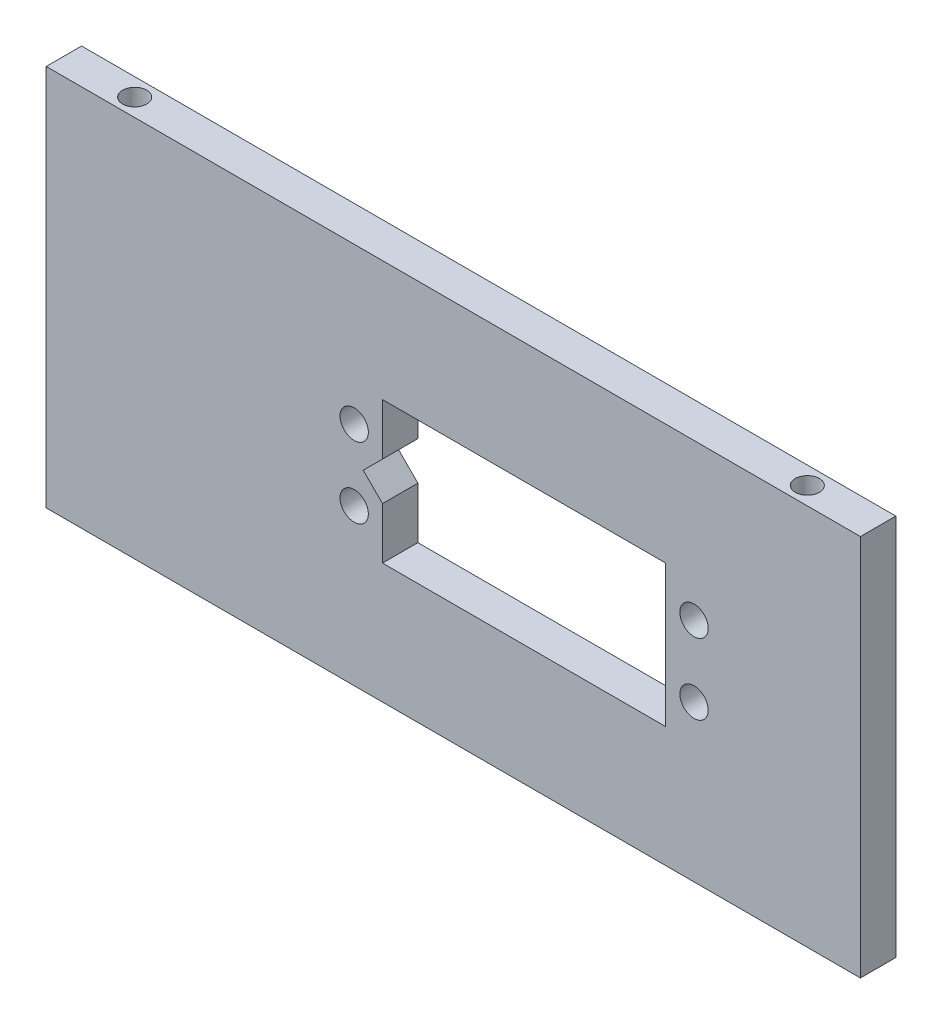
ISO-10303-21;
HEADER;
FILE_DESCRIPTION(('STEP AP214'),'2;1');
FILE_NAME('part.step','',(''),(''),'','','');
FILE_SCHEMA(('AUTOMOTIVE_DESIGN { 1 0 10303 214 1 1 1 1 }'));
ENDSEC;
DATA;
#1=APPLICATION_CONTEXT('core data for automotive mechanical design processes');
#2=APPLICATION_PROTOCOL_DEFINITION('international standard','automotive_design',2000,#1);
#3=PRODUCT_CONTEXT('',#1,'mechanical');
#4=PRODUCT('Part','Part','',(#3));
#5=PRODUCT_RELATED_PRODUCT_CATEGORY('part','',(#4));
#6=PRODUCT_DEFINITION_FORMATION('','',#4);
#7=PRODUCT_DEFINITION_CONTEXT('part definition',#1,'design');
#8=PRODUCT_DEFINITION('design','',#6,#7);
#9=PRODUCT_DEFINITION_SHAPE('','',#8);
#10=(LENGTH_UNIT() NAMED_UNIT(*) SI_UNIT(.MILLI.,.METRE.));
#11=(NAMED_UNIT(*) PLANE_ANGLE_UNIT() SI_UNIT($,.RADIAN.));
#12=(NAMED_UNIT(*) SI_UNIT($,.STERADIAN.) SOLID_ANGLE_UNIT());
#13=UNCERTAINTY_MEASURE_WITH_UNIT(LENGTH_MEASURE(1.E-05),#10,'distance_accuracy_value','');
#14=(GEOMETRIC_REPRESENTATION_CONTEXT(3) GLOBAL_UNCERTAINTY_ASSIGNED_CONTEXT((#13)) GLOBAL_UNIT_ASSIGNED_CONTEXT((#10,
#11,#12)) REPRESENTATION_CONTEXT('',''));
#15=CARTESIAN_POINT('',(0.,0.,0.));
#16=DIRECTION('',(0.,0.,1.));
#17=DIRECTION('',(1.,0.,0.));
#18=AXIS2_PLACEMENT_3D('',#15,#16,#17);
#19=CARTESIAN_POINT('',(3.06248058403234,6.51590056603846,5.));
#20=DIRECTION('',(1.,0.,0.));
#21=DIRECTION('',(0.,0.,-1.));
#22=AXIS2_PLACEMENT_3D('',#19,#20,#21);
#23=PLANE('',#22);
#24=DIRECTION('',(0.,0.,1.));
#25=VECTOR('',#24,1.);
#26=CARTESIAN_POINT('',(3.06248058403234,-0.762325883736207,5.));
#27=LINE('',#26,#25);
#28=CARTESIAN_POINT('',(3.06248058403234,-0.762325883736207,0.));
#29=VERTEX_POINT('',#28);
#30=CARTESIAN_POINT('',(3.06248058403234,-0.762325883736207,5.));
#31=VERTEX_POINT('',#30);
#32=EDGE_CURVE('E12',#29,#31,#27,.T.);
#33=ORIENTED_EDGE('',*,*,#32,.F.);
#34=DIRECTION('',(0.,-1.,0.));
#35=VECTOR('',#34,1.);
#36=CARTESIAN_POINT('',(3.06248058403234,6.51590056603846,0.));
#37=LINE('',#36,#35);
#38=CARTESIAN_POINT('',(3.06248058403234,6.51590056603846,0.));
#39=VERTEX_POINT('',#38);
#40=EDGE_CURVE('E254',#39,#29,#37,.T.);
#41=ORIENTED_EDGE('',*,*,#40,.F.);
#42=DIRECTION('',(0.,0.,-1.));
#43=VECTOR('',#42,1.);
#44=CARTESIAN_POINT('',(3.06248058403234,6.51590056603846,5.));
#45=LINE('',#44,#43);
#46=CARTESIAN_POINT('',(3.06248058403234,6.51590056603846,5.));
#47=VERTEX_POINT('',#46);
#48=EDGE_CURVE('E253',#47,#39,#45,.T.);
#49=ORIENTED_EDGE('',*,*,#48,.F.);
#50=DIRECTION('',(0.,-1.,0.));
#51=VECTOR('',#50,1.);
#52=CARTESIAN_POINT('',(3.06248058403234,6.51590056603846,5.));
#53=LINE('',#52,#51);
#54=EDGE_CURVE('E245',#47,#31,#53,.T.);
#55=ORIENTED_EDGE('',*,*,#54,.T.);
#56=EDGE_LOOP('',(#33,#41,#49,#55));
#57=FACE_BOUND('',#56,.T.);
#58=ADVANCED_FACE('F117',(#57),#23,.T.);
#59=CARTESIAN_POINT('',(0.,0.,5.));
#60=DIRECTION('',(0.,0.,1.));
#61=DIRECTION('',(1.,0.,0.));
#62=AXIS2_PLACEMENT_3D('',#59,#60,#61);
#63=PLANE('',#62);
#64=DIRECTION('',(-0.707106781186539,-0.707106781186556,0.));
#65=VECTOR('',#64,1.);
#66=CARTESIAN_POINT('',(3.06248058403234,-0.762325883736207,5.));
#67=LINE('',#66,#65);
#68=CARTESIAN_POINT('',(0.340707033807064,-3.48409943396155,5.));
#69=VERTEX_POINT('',#68);
#70=EDGE_CURVE('E207',#31,#69,#67,.T.);
#71=ORIENTED_EDGE('',*,*,#70,.F.);
#72=ORIENTED_EDGE('',*,*,#54,.F.);
#73=DIRECTION('',(1.,0.,0.));
#74=VECTOR('',#73,1.);
#75=CARTESIAN_POINT('',(3.06248058403234,6.51590056603846,5.));
#76=LINE('',#75,#74);
#77=CARTESIAN_POINT('',(43.0624805840323,6.51590056603846,5.));
#78=VERTEX_POINT('',#77);
#79=EDGE_CURVE('E250',#47,#78,#76,.T.);
#80=ORIENTED_EDGE('',*,*,#79,.T.);
#81=DIRECTION('',(0.,-1.,0.));
#82=VECTOR('',#81,1.);
#83=CARTESIAN_POINT('',(43.0624805840323,6.51590056603846,5.));
#84=LINE('',#83,#82);
#85=CARTESIAN_POINT('',(43.0624805840323,-13.4840994339615,5.));
#86=VERTEX_POINT('',#85);
#87=EDGE_CURVE('E140',#78,#86,#84,.T.);
#88=ORIENTED_EDGE('',*,*,#87,.T.);
#89=DIRECTION('',(1.,0.,0.));
#90=VECTOR('',#89,1.);
#91=CARTESIAN_POINT('',(3.06248058403234,-13.4840994339615,5.));
#92=LINE('',#91,#90);
#93=CARTESIAN_POINT('',(3.06248058403234,-13.4840994339615,5.));
#94=VERTEX_POINT('',#93);
#95=EDGE_CURVE('E247',#94,#86,#92,.T.);
#96=ORIENTED_EDGE('',*,*,#95,.F.);
#97=CARTESIAN_POINT('',(3.06248058403234,-6.20587298418675,5.));
#98=VERTEX_POINT('',#97);
#99=EDGE_CURVE('E219',#98,#94,#53,.T.);
#100=ORIENTED_EDGE('',*,*,#99,.F.);
#101=DIRECTION('',(0.707106781186556,-0.707106781186539,0.));
#102=VECTOR('',#101,1.);
#103=CARTESIAN_POINT('',(0.340707033807064,-3.48409943396155,5.));
#104=LINE('',#103,#102);
#105=EDGE_CURVE('E132',#69,#98,#104,.T.);
#106=ORIENTED_EDGE('',*,*,#105,.F.);
#107=EDGE_LOOP('',(#71,#72,#80,#88,#96,#100,#106));
#108=FACE_BOUND('',#107,.T.);
#109=CARTESIAN_POINT('',(-0.937519415967665,-8.48409943396155,5.));
#110=DIRECTION('',(0.,0.,1.));
#111=DIRECTION('',(1.,0.,0.));
#112=AXIS2_PLACEMENT_3D('',#109,#110,#111);
#113=CIRCLE('',#112,2.);
#114=CARTESIAN_POINT('',(1.06248058403234,-8.48409943396155,5.));
#115=VERTEX_POINT('',#114);
#116=EDGE_CURVE('E276',#115,#115,#113,.T.);
#117=ORIENTED_EDGE('',*,*,#116,.F.);
#118=EDGE_LOOP('',(#117));
#119=FACE_BOUND('',#118,.T.);
#120=CARTESIAN_POINT('',(-0.937519415967661,1.51590056603845,5.));
#121=DIRECTION('',(0.,0.,1.));
#122=DIRECTION('',(1.,0.,0.));
#123=AXIS2_PLACEMENT_3D('',#120,#121,#122);
#124=CIRCLE('',#123,2.);
#125=CARTESIAN_POINT('',(1.06248058403234,1.51590056603845,5.));
#126=VERTEX_POINT('',#125);
#127=EDGE_CURVE('E288',#126,#126,#124,.T.);
#128=ORIENTED_EDGE('',*,*,#127,.F.);
#129=EDGE_LOOP('',(#128));
#130=FACE_BOUND('',#129,.T.);
#131=DIRECTION('',(0.,-1.,0.));
#132=VECTOR('',#131,1.);
#133=CARTESIAN_POINT('',(-44.4375194159677,23.5159005660385,5.));
#134=LINE('',#133,#132);
#135=CARTESIAN_POINT('',(-44.4375194159677,23.5159005660385,5.));
#136=VERTEX_POINT('',#135);
#137=CARTESIAN_POINT('',(-44.4375194159677,-30.4840994339615,5.));
#138=VERTEX_POINT('',#137);
#139=EDGE_CURVE('E294',#136,#138,#134,.T.);
#140=ORIENTED_EDGE('',*,*,#139,.T.);
#141=DIRECTION('',(1.,0.,0.));
#142=VECTOR('',#141,1.);
#143=CARTESIAN_POINT('',(-44.4375194159677,-30.4840994339615,5.));
#144=LINE('',#143,#142);
#145=CARTESIAN_POINT('',(70.5624805840323,-30.4840994339615,5.));
#146=VERTEX_POINT('',#145);
#147=EDGE_CURVE('E297',#138,#146,#144,.T.);
#148=ORIENTED_EDGE('',*,*,#147,.T.);
#149=DIRECTION('',(0.,-1.,0.));
#150=VECTOR('',#149,1.);
#151=CARTESIAN_POINT('',(70.5624805840323,23.5159005660385,5.));
#152=LINE('',#151,#150);
#153=CARTESIAN_POINT('',(70.5624805840323,23.5159005660385,5.));
#154=VERTEX_POINT('',#153);
#155=EDGE_CURVE('E300',#154,#146,#152,.T.);
#156=ORIENTED_EDGE('',*,*,#155,.F.);
#157=DIRECTION('',(1.,0.,0.));
#158=VECTOR('',#157,1.);
#159=CARTESIAN_POINT('',(-44.4375194159677,23.5159005660385,5.));
#160=LINE('',#159,#158);
#161=EDGE_CURVE('E303',#136,#154,#160,.T.);
#162=ORIENTED_EDGE('',*,*,#161,.F.);
#163=EDGE_LOOP('',(#140,#148,#156,#162));
#164=FACE_BOUND('',#163,.T.);
#165=CARTESIAN_POINT('',(47.0624805840323,-8.48409943396155,5.));
#166=DIRECTION('',(0.,0.,1.));
#167=DIRECTION('',(1.,0.,0.));
#168=AXIS2_PLACEMENT_3D('',#165,#166,#167);
#169=CIRCLE('',#168,2.);
#170=CARTESIAN_POINT('',(49.0624805840323,-8.48409943396155,5.));
#171=VERTEX_POINT('',#170);
#172=EDGE_CURVE('E282',#171,#171,#169,.T.);
#173=ORIENTED_EDGE('',*,*,#172,.F.);
#174=EDGE_LOOP('',(#173));
#175=FACE_BOUND('',#174,.T.);
#176=CARTESIAN_POINT('',(47.0624805840323,1.51590056603845,5.));
#177=DIRECTION('',(0.,0.,1.));
#178=DIRECTION('',(1.,0.,0.));
#179=AXIS2_PLACEMENT_3D('',#176,#177,#178);
#180=CIRCLE('',#179,2.);
#181=CARTESIAN_POINT('',(49.0624805840323,1.51590056603845,5.));
#182=VERTEX_POINT('',#181);
#183=EDGE_CURVE('E239',#182,#182,#180,.T.);
#184=ORIENTED_EDGE('',*,*,#183,.F.);
#185=EDGE_LOOP('',(#184));
#186=FACE_BOUND('',#185,.T.);
#187=ADVANCED_FACE('F216',(#108,#119,#130,#164,#175,#186),#63,.T.);
#188=CARTESIAN_POINT('',(0.,0.,0.));
#189=DIRECTION('',(0.,0.,1.));
#190=DIRECTION('',(1.,0.,0.));
#191=AXIS2_PLACEMENT_3D('',#188,#189,#190);
#192=PLANE('',#191);
#193=CARTESIAN_POINT('',(-0.937519415967665,-8.48409943396155,0.));
#194=DIRECTION('',(0.,0.,1.));
#195=DIRECTION('',(1.,0.,0.));
#196=AXIS2_PLACEMENT_3D('',#193,#194,#195);
#197=CIRCLE('',#196,2.);
#198=CARTESIAN_POINT('',(1.06248058403234,-8.48409943396155,0.));
#199=VERTEX_POINT('',#198);
#200=EDGE_CURVE('E275',#199,#199,#197,.T.);
#201=ORIENTED_EDGE('',*,*,#200,.T.);
#202=EDGE_LOOP('',(#201));
#203=FACE_BOUND('',#202,.T.);
#204=CARTESIAN_POINT('',(47.0624805840323,-8.48409943396155,0.));
#205=DIRECTION('',(0.,0.,1.));
#206=DIRECTION('',(1.,0.,0.));
#207=AXIS2_PLACEMENT_3D('',#204,#205,#206);
#208=CIRCLE('',#207,2.);
#209=CARTESIAN_POINT('',(49.0624805840323,-8.48409943396155,0.));
#210=VERTEX_POINT('',#209);
#211=EDGE_CURVE('E279',#210,#210,#208,.T.);
#212=ORIENTED_EDGE('',*,*,#211,.T.);
#213=EDGE_LOOP('',(#212));
#214=FACE_BOUND('',#213,.T.);
#215=CARTESIAN_POINT('',(-0.937519415967661,1.51590056603845,0.));
#216=DIRECTION('',(0.,0.,1.));
#217=DIRECTION('',(1.,0.,0.));
#218=AXIS2_PLACEMENT_3D('',#215,#216,#217);
#219=CIRCLE('',#218,2.);
#220=CARTESIAN_POINT('',(1.06248058403234,1.51590056603845,0.));
#221=VERTEX_POINT('',#220);
#222=EDGE_CURVE('E285',#221,#221,#219,.T.);
#223=ORIENTED_EDGE('',*,*,#222,.T.);
#224=EDGE_LOOP('',(#223));
#225=FACE_BOUND('',#224,.T.);
#226=DIRECTION('',(0.,-1.,0.));
#227=VECTOR('',#226,1.);
#228=CARTESIAN_POINT('',(-44.4375194159677,23.5159005660385,0.));
#229=LINE('',#228,#227);
#230=CARTESIAN_POINT('',(-44.4375194159677,23.5159005660385,0.));
#231=VERTEX_POINT('',#230);
#232=CARTESIAN_POINT('',(-44.4375194159677,-30.4840994339615,0.));
#233=VERTEX_POINT('',#232);
#234=EDGE_CURVE('E291',#231,#233,#229,.T.);
#235=ORIENTED_EDGE('',*,*,#234,.F.);
#236=DIRECTION('',(1.,0.,0.));
#237=VECTOR('',#236,1.);
#238=CARTESIAN_POINT('',(-44.4375194159677,23.5159005660385,0.));
#239=LINE('',#238,#237);
#240=CARTESIAN_POINT('',(70.5624805840323,23.5159005660385,0.));
#241=VERTEX_POINT('',#240);
#242=EDGE_CURVE('E298',#231,#241,#239,.T.);
#243=ORIENTED_EDGE('',*,*,#242,.T.);
#244=DIRECTION('',(0.,-1.,0.));
#245=VECTOR('',#244,1.);
#246=CARTESIAN_POINT('',(70.5624805840323,23.5159005660385,0.));
#247=LINE('',#246,#245);
#248=CARTESIAN_POINT('',(70.5624805840323,-30.4840994339615,0.));
#249=VERTEX_POINT('',#248);
#250=EDGE_CURVE('E312',#241,#249,#247,.T.);
#251=ORIENTED_EDGE('',*,*,#250,.T.);
#252=DIRECTION('',(1.,0.,0.));
#253=VECTOR('',#252,1.);
#254=CARTESIAN_POINT('',(-44.4375194159677,-30.4840994339615,0.));
#255=LINE('',#254,#253);
#256=EDGE_CURVE('E309',#233,#249,#255,.T.);
#257=ORIENTED_EDGE('',*,*,#256,.F.);
#258=EDGE_LOOP('',(#235,#243,#251,#257));
#259=FACE_BOUND('',#258,.T.);
#260=ORIENTED_EDGE('',*,*,#40,.T.);
#261=DIRECTION('',(-0.707106781186539,-0.707106781186556,0.));
#262=VECTOR('',#261,1.);
#263=CARTESIAN_POINT('',(1.91240323388431,-1.91240323388426,0.));
#264=LINE('',#263,#262);
#265=CARTESIAN_POINT('',(0.340707033807064,-3.48409943396155,0.));
#266=VERTEX_POINT('',#265);
#267=EDGE_CURVE('E224',#29,#266,#264,.T.);
#268=ORIENTED_EDGE('',*,*,#267,.T.);
#269=DIRECTION('',(0.707106781186556,-0.707106781186539,0.));
#270=VECTOR('',#269,1.);
#271=CARTESIAN_POINT('',(-1.57169620007724,-1.57169620007728,0.));
#272=LINE('',#271,#270);
#273=CARTESIAN_POINT('',(3.06248058403234,-6.20587298418675,0.));
#274=VERTEX_POINT('',#273);
#275=EDGE_CURVE('E202',#266,#274,#272,.T.);
#276=ORIENTED_EDGE('',*,*,#275,.T.);
#277=CARTESIAN_POINT('',(3.06248058403234,-13.4840994339615,0.));
#278=VERTEX_POINT('',#277);
#279=EDGE_CURVE('E242',#274,#278,#37,.T.);
#280=ORIENTED_EDGE('',*,*,#279,.T.);
#281=DIRECTION('',(1.,0.,0.));
#282=VECTOR('',#281,1.);
#283=CARTESIAN_POINT('',(3.06248058403234,-13.4840994339615,0.));
#284=LINE('',#283,#282);
#285=CARTESIAN_POINT('',(43.0624805840323,-13.4840994339615,0.));
#286=VERTEX_POINT('',#285);
#287=EDGE_CURVE('E257',#278,#286,#284,.T.);
#288=ORIENTED_EDGE('',*,*,#287,.T.);
#289=DIRECTION('',(0.,-1.,0.));
#290=VECTOR('',#289,1.);
#291=CARTESIAN_POINT('',(43.0624805840323,6.51590056603846,0.));
#292=LINE('',#291,#290);
#293=CARTESIAN_POINT('',(43.0624805840323,6.51590056603846,0.));
#294=VERTEX_POINT('',#293);
#295=EDGE_CURVE('E260',#294,#286,#292,.T.);
#296=ORIENTED_EDGE('',*,*,#295,.F.);
#297=DIRECTION('',(1.,0.,0.));
#298=VECTOR('',#297,1.);
#299=CARTESIAN_POINT('',(3.06248058403234,6.51590056603846,0.));
#300=LINE('',#299,#298);
#301=EDGE_CURVE('E263',#39,#294,#300,.T.);
#302=ORIENTED_EDGE('',*,*,#301,.F.);
#303=EDGE_LOOP('',(#260,#268,#276,#280,#288,#296,#302));
#304=FACE_BOUND('',#303,.T.);
#305=CARTESIAN_POINT('',(47.0624805840323,1.51590056603845,0.));
#306=DIRECTION('',(0.,0.,1.));
#307=DIRECTION('',(1.,0.,0.));
#308=AXIS2_PLACEMENT_3D('',#305,#306,#307);
#309=CIRCLE('',#308,2.);
#310=CARTESIAN_POINT('',(49.0624805840323,1.51590056603845,0.));
#311=VERTEX_POINT('',#310);
#312=EDGE_CURVE('E230',#311,#311,#309,.T.);
#313=ORIENTED_EDGE('',*,*,#312,.T.);
#314=EDGE_LOOP('',(#313));
#315=FACE_BOUND('',#314,.T.);
#316=ADVANCED_FACE('F327',(#203,#214,#225,#259,#304,#315),#192,.F.);
#317=CARTESIAN_POINT('',(-44.4375194159677,23.5159005660385,5.));
#318=DIRECTION('',(1.,0.,0.));
#319=DIRECTION('',(0.,1.,0.));
#320=AXIS2_PLACEMENT_3D('',#317,#318,#319);
#321=PLANE('',#320);
#322=ORIENTED_EDGE('',*,*,#234,.T.);
#323=DIRECTION('',(0.,0.,-1.));
#324=VECTOR('',#323,1.);
#325=CARTESIAN_POINT('',(-44.4375194159677,-30.4840994339615,5.));
#326=LINE('',#325,#324);
#327=EDGE_CURVE('E322',#138,#233,#326,.T.);
#328=ORIENTED_EDGE('',*,*,#327,.F.);
#329=ORIENTED_EDGE('',*,*,#139,.F.);
#330=DIRECTION('',(0.,0.,-1.));
#331=VECTOR('',#330,1.);
#332=CARTESIAN_POINT('',(-44.4375194159677,23.5159005660385,5.));
#333=LINE('',#332,#331);
#334=EDGE_CURVE('E306',#136,#231,#333,.T.);
#335=ORIENTED_EDGE('',*,*,#334,.T.);
#336=EDGE_LOOP('',(#322,#328,#329,#335));
#337=FACE_BOUND('',#336,.T.);
#338=ADVANCED_FACE('F119',(#337),#321,.F.);
#339=CARTESIAN_POINT('',(-44.4375194159677,-30.4840994339615,5.));
#340=DIRECTION('',(0.,1.,0.));
#341=DIRECTION('',(0.,0.,1.));
#342=AXIS2_PLACEMENT_3D('',#339,#340,#341);
#343=PLANE('',#342);
#344=CARTESIAN_POINT('',(-2.93751941596766,-30.4840994339615,2.5));
#345=DIRECTION('',(0.,-1.,0.));
#346=DIRECTION('',(0.,0.,-1.));
#347=AXIS2_PLACEMENT_3D('',#344,#345,#346);
#348=CIRCLE('',#347,1.75);
#349=CARTESIAN_POINT('',(-2.93751941596766,-30.4840994339615,0.749999999999996));
#350=VERTEX_POINT('',#349);
#351=EDGE_CURVE('E231',#350,#350,#348,.T.);
#352=ORIENTED_EDGE('',*,*,#351,.F.);
#353=EDGE_LOOP('',(#352));
#354=FACE_BOUND('',#353,.T.);
#355=CARTESIAN_POINT('',(29.0624805840323,-30.4840994339615,2.5));
#356=DIRECTION('',(0.,-1.,0.));
#357=DIRECTION('',(0.,0.,-1.));
#358=AXIS2_PLACEMENT_3D('',#355,#356,#357);
#359=CIRCLE('',#358,1.75);
#360=CARTESIAN_POINT('',(29.0624805840323,-30.4840994339615,0.749999999999996));
#361=VERTEX_POINT('',#360);
#362=EDGE_CURVE('E234',#361,#361,#359,.T.);
#363=ORIENTED_EDGE('',*,*,#362,.F.);
#364=EDGE_LOOP('',(#363));
#365=FACE_BOUND('',#364,.T.);
#366=ORIENTED_EDGE('',*,*,#256,.T.);
#367=DIRECTION('',(0.,0.,-1.));
#368=VECTOR('',#367,1.);
#369=CARTESIAN_POINT('',(70.5624805840323,-30.4840994339615,5.));
#370=LINE('',#369,#368);
#371=EDGE_CURVE('E320',#146,#249,#370,.T.);
#372=ORIENTED_EDGE('',*,*,#371,.F.);
#373=ORIENTED_EDGE('',*,*,#147,.F.);
#374=ORIENTED_EDGE('',*,*,#327,.T.);
#375=EDGE_LOOP('',(#366,#372,#373,#374));
#376=FACE_BOUND('',#375,.T.);
#377=ADVANCED_FACE('F377',(#354,#365,#376),#343,.F.);
#378=CARTESIAN_POINT('',(70.5624805840323,23.5159005660385,5.));
#379=DIRECTION('',(1.,0.,0.));
#380=DIRECTION('',(0.,0.,-1.));
#381=AXIS2_PLACEMENT_3D('',#378,#379,#380);
#382=PLANE('',#381);
#383=ORIENTED_EDGE('',*,*,#250,.F.);
#384=DIRECTION('',(0.,0.,-1.));
#385=VECTOR('',#384,1.);
#386=CARTESIAN_POINT('',(70.5624805840323,23.5159005660385,5.));
#387=LINE('',#386,#385);
#388=EDGE_CURVE('E318',#154,#241,#387,.T.);
#389=ORIENTED_EDGE('',*,*,#388,.F.);
#390=ORIENTED_EDGE('',*,*,#155,.T.);
#391=ORIENTED_EDGE('',*,*,#371,.T.);
#392=EDGE_LOOP('',(#383,#389,#390,#391));
#393=FACE_BOUND('',#392,.T.);
#394=ADVANCED_FACE('F374',(#393),#382,.T.);
#395=CARTESIAN_POINT('',(-44.4375194159677,23.5159005660385,5.));
#396=DIRECTION('',(0.,1.,0.));
#397=DIRECTION('',(0.,0.,1.));
#398=AXIS2_PLACEMENT_3D('',#395,#396,#397);
#399=PLANE('',#398);
#400=CARTESIAN_POINT('',(60.5624805840323,23.5159005660385,2.5));
#401=DIRECTION('',(0.,1.,0.));
#402=DIRECTION('',(0.,0.,1.));
#403=AXIS2_PLACEMENT_3D('',#400,#401,#402);
#404=CIRCLE('',#403,1.7);
#405=CARTESIAN_POINT('',(60.5624805840323,23.5159005660385,4.2));
#406=VERTEX_POINT('',#405);
#407=EDGE_CURVE('E565',#406,#406,#404,.T.);
#408=ORIENTED_EDGE('',*,*,#407,.F.);
#409=EDGE_LOOP('',(#408));
#410=FACE_BOUND('',#409,.T.);
#411=CARTESIAN_POINT('',(-34.4375194159677,23.5159005660385,2.5));
#412=DIRECTION('',(0.,1.,0.));
#413=DIRECTION('',(0.,0.,1.));
#414=AXIS2_PLACEMENT_3D('',#411,#412,#413);
#415=CIRCLE('',#414,1.7);
#416=CARTESIAN_POINT('',(-34.4375194159677,23.5159005660385,4.2));
#417=VERTEX_POINT('',#416);
#418=EDGE_CURVE('E568',#417,#417,#415,.T.);
#419=ORIENTED_EDGE('',*,*,#418,.F.);
#420=EDGE_LOOP('',(#419));
#421=FACE_BOUND('',#420,.T.);
#422=ORIENTED_EDGE('',*,*,#242,.F.);
#423=ORIENTED_EDGE('',*,*,#334,.F.);
#424=ORIENTED_EDGE('',*,*,#161,.T.);
#425=ORIENTED_EDGE('',*,*,#388,.T.);
#426=EDGE_LOOP('',(#422,#423,#424,#425));
#427=FACE_BOUND('',#426,.T.);
#428=ADVANCED_FACE('F366',(#410,#421,#427),#399,.T.);
#429=CARTESIAN_POINT('',(-0.937519415967661,1.51590056603845,5.));
#430=DIRECTION('',(0.,0.,-1.));
#431=DIRECTION('',(-1.,0.,0.));
#432=AXIS2_PLACEMENT_3D('',#429,#430,#431);
#433=CYLINDRICAL_SURFACE('',#432,2.);
#434=ORIENTED_EDGE('',*,*,#127,.T.);
#435=EDGE_LOOP('',(#434));
#436=FACE_BOUND('',#435,.T.);
#437=ORIENTED_EDGE('',*,*,#222,.F.);
#438=EDGE_LOOP('',(#437));
#439=FACE_BOUND('',#438,.T.);
#440=ADVANCED_FACE('F360',(#436,#439),#433,.F.);
#441=CARTESIAN_POINT('',(47.0624805840323,-8.48409943396155,5.));
#442=DIRECTION('',(0.,0.,-1.));
#443=DIRECTION('',(-1.,0.,0.));
#444=AXIS2_PLACEMENT_3D('',#441,#442,#443);
#445=CYLINDRICAL_SURFACE('',#444,2.);
#446=ORIENTED_EDGE('',*,*,#172,.T.);
#447=EDGE_LOOP('',(#446));
#448=FACE_BOUND('',#447,.T.);
#449=ORIENTED_EDGE('',*,*,#211,.F.);
#450=EDGE_LOOP('',(#449));
#451=FACE_BOUND('',#450,.T.);
#452=ADVANCED_FACE('F355',(#448,#451),#445,.F.);
#453=CARTESIAN_POINT('',(-0.937519415967665,-8.48409943396155,5.));
#454=DIRECTION('',(0.,0.,-1.));
#455=DIRECTION('',(-1.,0.,0.));
#456=AXIS2_PLACEMENT_3D('',#453,#454,#455);
#457=CYLINDRICAL_SURFACE('',#456,2.);
#458=ORIENTED_EDGE('',*,*,#116,.T.);
#459=EDGE_LOOP('',(#458));
#460=FACE_BOUND('',#459,.T.);
#461=ORIENTED_EDGE('',*,*,#200,.F.);
#462=EDGE_LOOP('',(#461));
#463=FACE_BOUND('',#462,.T.);
#464=ADVANCED_FACE('F350',(#460,#463),#457,.F.);
#465=DIRECTION('',(0.,0.,-1.));
#466=VECTOR('',#465,1.);
#467=CARTESIAN_POINT('',(3.06248058403234,-6.20587298418675,5.));
#468=LINE('',#467,#466);
#469=EDGE_CURVE('E125',#98,#274,#468,.T.);
#470=ORIENTED_EDGE('',*,*,#469,.F.);
#471=ORIENTED_EDGE('',*,*,#99,.T.);
#472=DIRECTION('',(0.,0.,-1.));
#473=VECTOR('',#472,1.);
#474=CARTESIAN_POINT('',(3.06248058403234,-13.4840994339615,5.));
#475=LINE('',#474,#473);
#476=EDGE_CURVE('E272',#94,#278,#475,.T.);
#477=ORIENTED_EDGE('',*,*,#476,.T.);
#478=ORIENTED_EDGE('',*,*,#279,.F.);
#479=EDGE_LOOP('',(#470,#471,#477,#478));
#480=FACE_BOUND('',#479,.T.);
#481=ADVANCED_FACE('F330',(#480),#23,.T.);
#482=CARTESIAN_POINT('',(3.06248058403234,-13.4840994339615,5.));
#483=DIRECTION('',(0.,1.,0.));
#484=DIRECTION('',(-1.,0.,0.));
#485=AXIS2_PLACEMENT_3D('',#482,#483,#484);
#486=PLANE('',#485);
#487=ORIENTED_EDGE('',*,*,#287,.F.);
#488=ORIENTED_EDGE('',*,*,#476,.F.);
#489=ORIENTED_EDGE('',*,*,#95,.T.);
#490=DIRECTION('',(0.,0.,-1.));
#491=VECTOR('',#490,1.);
#492=CARTESIAN_POINT('',(43.0624805840323,-13.4840994339615,5.));
#493=LINE('',#492,#491);
#494=EDGE_CURVE('E270',#86,#286,#493,.T.);
#495=ORIENTED_EDGE('',*,*,#494,.T.);
#496=EDGE_LOOP('',(#487,#488,#489,#495));
#497=FACE_BOUND('',#496,.T.);
#498=ADVANCED_FACE('F333',(#497),#486,.T.);
#499=CARTESIAN_POINT('',(43.0624805840323,6.51590056603846,5.));
#500=DIRECTION('',(1.,0.,0.));
#501=DIRECTION('',(0.,0.,-1.));
#502=AXIS2_PLACEMENT_3D('',#499,#500,#501);
#503=PLANE('',#502);
#504=ORIENTED_EDGE('',*,*,#295,.T.);
#505=ORIENTED_EDGE('',*,*,#494,.F.);
#506=ORIENTED_EDGE('',*,*,#87,.F.);
#507=DIRECTION('',(0.,0.,-1.));
#508=VECTOR('',#507,1.);
#509=CARTESIAN_POINT('',(43.0624805840323,6.51590056603846,5.));
#510=LINE('',#509,#508);
#511=EDGE_CURVE('E268',#78,#294,#510,.T.);
#512=ORIENTED_EDGE('',*,*,#511,.T.);
#513=EDGE_LOOP('',(#504,#505,#506,#512));
#514=FACE_BOUND('',#513,.T.);
#515=ADVANCED_FACE('F339',(#514),#503,.F.);
#516=CARTESIAN_POINT('',(3.06248058403234,6.51590056603846,5.));
#517=DIRECTION('',(0.,1.,0.));
#518=DIRECTION('',(0.,0.,1.));
#519=AXIS2_PLACEMENT_3D('',#516,#517,#518);
#520=PLANE('',#519);
#521=ORIENTED_EDGE('',*,*,#301,.T.);
#522=ORIENTED_EDGE('',*,*,#511,.F.);
#523=ORIENTED_EDGE('',*,*,#79,.F.);
#524=ORIENTED_EDGE('',*,*,#48,.T.);
#525=EDGE_LOOP('',(#521,#522,#523,#524));
#526=FACE_BOUND('',#525,.T.);
#527=ADVANCED_FACE('F336',(#526),#520,.F.);
#528=CARTESIAN_POINT('',(47.0624805840323,1.51590056603845,5.));
#529=DIRECTION('',(0.,0.,-1.));
#530=DIRECTION('',(-1.,0.,0.));
#531=AXIS2_PLACEMENT_3D('',#528,#529,#530);
#532=CYLINDRICAL_SURFACE('',#531,2.);
#533=ORIENTED_EDGE('',*,*,#183,.T.);
#534=EDGE_LOOP('',(#533));
#535=FACE_BOUND('',#534,.T.);
#536=ORIENTED_EDGE('',*,*,#312,.F.);
#537=EDGE_LOOP('',(#536));
#538=FACE_BOUND('',#537,.T.);
#539=ADVANCED_FACE('F405',(#535,#538),#532,.F.);
#540=CARTESIAN_POINT('',(29.0624805840323,-15.4840994339615,2.5));
#541=DIRECTION('',(0.,-1.,0.));
#542=DIRECTION('',(0.,0.,-1.));
#543=AXIS2_PLACEMENT_3D('',#540,#541,#542);
#544=CYLINDRICAL_SURFACE('',#543,1.75);
#545=CARTESIAN_POINT('',(29.0624805840323,-15.4840994339615,2.5));
#546=DIRECTION('',(0.,-1.,0.));
#547=DIRECTION('',(0.,0.,-1.));
#548=AXIS2_PLACEMENT_3D('',#545,#546,#547);
#549=CIRCLE('',#548,1.75);
#550=CARTESIAN_POINT('',(29.0624805840323,-15.4840994339615,0.749999999999996));
#551=VERTEX_POINT('',#550);
#552=EDGE_CURVE('E226',#551,#551,#549,.T.);
#553=ORIENTED_EDGE('',*,*,#552,.F.);
#554=EDGE_LOOP('',(#553));
#555=FACE_BOUND('',#554,.T.);
#556=ORIENTED_EDGE('',*,*,#362,.T.);
#557=EDGE_LOOP('',(#556));
#558=FACE_BOUND('',#557,.T.);
#559=ADVANCED_FACE('F408',(#555,#558),#544,.F.);
#560=CARTESIAN_POINT('',(29.0624805840323,-15.4840994339615,2.5));
#561=DIRECTION('',(0.,-1.,0.));
#562=DIRECTION('',(0.,0.,-1.));
#563=AXIS2_PLACEMENT_3D('',#560,#561,#562);
#564=PLANE('',#563);
#565=ORIENTED_EDGE('',*,*,#552,.T.);
#566=EDGE_LOOP('',(#565));
#567=FACE_BOUND('',#566,.T.);
#568=ADVANCED_FACE('F415',(#567),#564,.T.);
#569=CARTESIAN_POINT('',(-2.93751941596766,-15.4840994339615,2.5));
#570=DIRECTION('',(0.,-1.,0.));
#571=DIRECTION('',(0.,0.,-1.));
#572=AXIS2_PLACEMENT_3D('',#569,#570,#571);
#573=CYLINDRICAL_SURFACE('',#572,1.75);
#574=CARTESIAN_POINT('',(-2.93751941596766,-15.4840994339615,2.5));
#575=DIRECTION('',(0.,-1.,0.));
#576=DIRECTION('',(0.,0.,-1.));
#577=AXIS2_PLACEMENT_3D('',#574,#575,#576);
#578=CIRCLE('',#577,1.75);
#579=CARTESIAN_POINT('',(-2.93751941596766,-15.4840994339615,0.749999999999996));
#580=VERTEX_POINT('',#579);
#581=EDGE_CURVE('E227',#580,#580,#578,.T.);
#582=ORIENTED_EDGE('',*,*,#581,.F.);
#583=EDGE_LOOP('',(#582));
#584=FACE_BOUND('',#583,.T.);
#585=ORIENTED_EDGE('',*,*,#351,.T.);
#586=EDGE_LOOP('',(#585));
#587=FACE_BOUND('',#586,.T.);
#588=ADVANCED_FACE('F455',(#584,#587),#573,.F.);
#589=CARTESIAN_POINT('',(-2.93751941596766,-15.4840994339615,2.5));
#590=DIRECTION('',(0.,-1.,0.));
#591=DIRECTION('',(0.,0.,-1.));
#592=AXIS2_PLACEMENT_3D('',#589,#590,#591);
#593=PLANE('',#592);
#594=ORIENTED_EDGE('',*,*,#581,.T.);
#595=EDGE_LOOP('',(#594));
#596=FACE_BOUND('',#595,.T.);
#597=ADVANCED_FACE('F464',(#596),#593,.T.);
#598=CARTESIAN_POINT('',(3.06248058403234,-0.762325883736207,-5.));
#599=DIRECTION('',(-0.707106781186556,0.707106781186539,0.));
#600=DIRECTION('',(-0.707106781186539,-0.707106781186556,0.));
#601=AXIS2_PLACEMENT_3D('',#598,#599,#600);
#602=PLANE('',#601);
#603=ORIENTED_EDGE('',*,*,#32,.T.);
#604=ORIENTED_EDGE('',*,*,#70,.T.);
#605=DIRECTION('',(0.,0.,1.));
#606=VECTOR('',#605,1.);
#607=CARTESIAN_POINT('',(0.340707033807064,-3.48409943396155,-5.));
#608=LINE('',#607,#606);
#609=EDGE_CURVE('E198',#266,#69,#608,.T.);
#610=ORIENTED_EDGE('',*,*,#609,.F.);
#611=ORIENTED_EDGE('',*,*,#267,.F.);
#612=EDGE_LOOP('',(#603,#604,#610,#611));
#613=FACE_BOUND('',#612,.T.);
#614=ADVANCED_FACE('F208',(#613),#602,.F.);
#615=CARTESIAN_POINT('',(0.340707033807064,-3.48409943396155,-5.));
#616=DIRECTION('',(-0.707106781186539,-0.707106781186556,0.));
#617=DIRECTION('',(0.707106781186556,-0.707106781186539,0.));
#618=AXIS2_PLACEMENT_3D('',#615,#616,#617);
#619=PLANE('',#618);
#620=ORIENTED_EDGE('',*,*,#609,.T.);
#621=ORIENTED_EDGE('',*,*,#105,.T.);
#622=ORIENTED_EDGE('',*,*,#469,.T.);
#623=ORIENTED_EDGE('',*,*,#275,.F.);
#624=EDGE_LOOP('',(#620,#621,#622,#623));
#625=FACE_BOUND('',#624,.T.);
#626=ADVANCED_FACE('F200',(#625),#619,.F.);
#627=CARTESIAN_POINT('',(-34.4375194159677,13.5159005660385,2.5));
#628=DIRECTION('',(0.,1.,0.));
#629=DIRECTION('',(0.,0.,1.));
#630=AXIS2_PLACEMENT_3D('',#627,#628,#629);
#631=CYLINDRICAL_SURFACE('',#630,1.7);
#632=CARTESIAN_POINT('',(-34.4375194159677,13.5159005660385,2.5));
#633=DIRECTION('',(0.,1.,0.));
#634=DIRECTION('',(0.,0.,1.));
#635=AXIS2_PLACEMENT_3D('',#632,#633,#634);
#636=CIRCLE('',#635,1.7);
#637=CARTESIAN_POINT('',(-34.4375194159677,13.5159005660385,4.2));
#638=VERTEX_POINT('',#637);
#639=EDGE_CURVE('E572',#638,#638,#636,.T.);
#640=ORIENTED_EDGE('',*,*,#639,.F.);
#641=EDGE_LOOP('',(#640));
#642=FACE_BOUND('',#641,.T.);
#643=ORIENTED_EDGE('',*,*,#418,.T.);
#644=EDGE_LOOP('',(#643));
#645=FACE_BOUND('',#644,.T.);
#646=ADVANCED_FACE('F513',(#642,#645),#631,.F.);
#647=CARTESIAN_POINT('',(-34.4375194159677,13.5159005660385,2.5));
#648=DIRECTION('',(0.,1.,0.));
#649=DIRECTION('',(0.,0.,1.));
#650=AXIS2_PLACEMENT_3D('',#647,#648,#649);
#651=PLANE('',#650);
#652=ORIENTED_EDGE('',*,*,#639,.T.);
#653=EDGE_LOOP('',(#652));
#654=FACE_BOUND('',#653,.T.);
#655=ADVANCED_FACE('F529',(#654),#651,.T.);
#656=CARTESIAN_POINT('',(60.5624805840323,13.5159005660385,2.5));
#657=DIRECTION('',(0.,1.,0.));
#658=DIRECTION('',(0.,0.,1.));
#659=AXIS2_PLACEMENT_3D('',#656,#657,#658);
#660=CYLINDRICAL_SURFACE('',#659,1.7);
#661=CARTESIAN_POINT('',(60.5624805840323,13.5159005660385,2.5));
#662=DIRECTION('',(0.,1.,0.));
#663=DIRECTION('',(0.,0.,1.));
#664=AXIS2_PLACEMENT_3D('',#661,#662,#663);
#665=CIRCLE('',#664,1.7);
#666=CARTESIAN_POINT('',(60.5624805840323,13.5159005660385,4.2));
#667=VERTEX_POINT('',#666);
#668=EDGE_CURVE('E213',#667,#667,#665,.T.);
#669=ORIENTED_EDGE('',*,*,#668,.F.);
#670=EDGE_LOOP('',(#669));
#671=FACE_BOUND('',#670,.T.);
#672=ORIENTED_EDGE('',*,*,#407,.T.);
#673=EDGE_LOOP('',(#672));
#674=FACE_BOUND('',#673,.T.);
#675=ADVANCED_FACE('F539',(#671,#674),#660,.F.);
#676=CARTESIAN_POINT('',(0.,13.5159005660385,0.));
#677=DIRECTION('',(0.,1.,0.));
#678=DIRECTION('',(0.,0.,1.));
#679=AXIS2_PLACEMENT_3D('',#676,#677,#678);
#680=PLANE('',#679);
#681=ORIENTED_EDGE('',*,*,#668,.T.);
#682=EDGE_LOOP('',(#681));
#683=FACE_BOUND('',#682,.T.);
#684=ADVANCED_FACE('F549',(#683),#680,.T.);
#685=CLOSED_SHELL('',(#58,#187,#316,#338,#377,#394,#428,#440,#452,#464,#481,#498,#515,#527,#539,
#559,#568,#588,#597,#614,#626,#646,#655,#675,#684));
#686=MANIFOLD_SOLID_BREP('B2',#685);
#687=ADVANCED_BREP_SHAPE_REPRESENTATION('',(#18,#686),#14);
#688=SHAPE_DEFINITION_REPRESENTATION(#9,#687);
ENDSEC;
END-ISO-10303-21;
